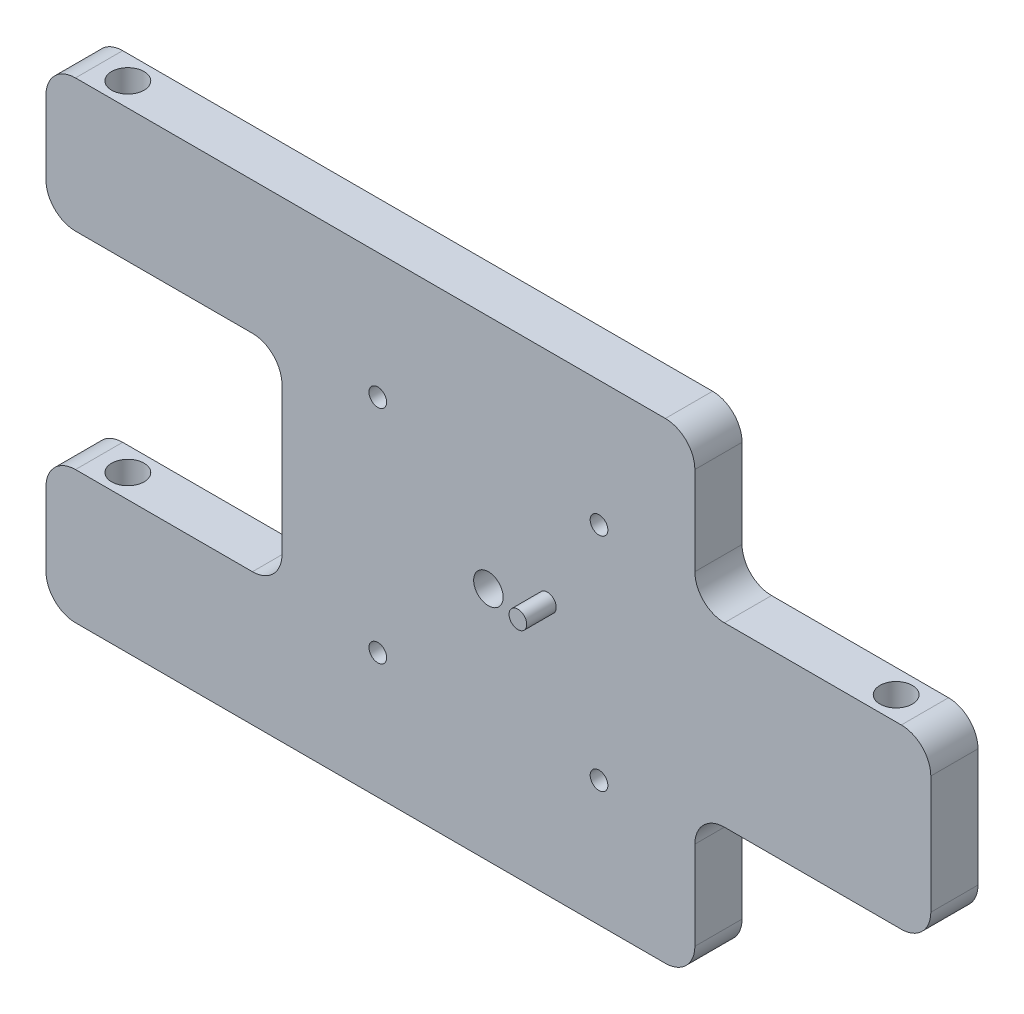
ISO-10303-21;
HEADER;
FILE_DESCRIPTION(('STEP AP214'),'2;1');
FILE_NAME('part.step','',(''),(''),'','','');
FILE_SCHEMA(('AUTOMOTIVE_DESIGN { 1 0 10303 214 1 1 1 1 }'));
ENDSEC;
DATA;
#1=APPLICATION_CONTEXT('core data for automotive mechanical design processes');
#2=APPLICATION_PROTOCOL_DEFINITION('international standard','automotive_design',2000,#1);
#3=PRODUCT_CONTEXT('',#1,'mechanical');
#4=PRODUCT('Part','Part','',(#3));
#5=PRODUCT_RELATED_PRODUCT_CATEGORY('part','',(#4));
#6=PRODUCT_DEFINITION_FORMATION('','',#4);
#7=PRODUCT_DEFINITION_CONTEXT('part definition',#1,'design');
#8=PRODUCT_DEFINITION('design','',#6,#7);
#9=PRODUCT_DEFINITION_SHAPE('','',#8);
#10=(LENGTH_UNIT() NAMED_UNIT(*) SI_UNIT(.MILLI.,.METRE.));
#11=(NAMED_UNIT(*) PLANE_ANGLE_UNIT() SI_UNIT($,.RADIAN.));
#12=(NAMED_UNIT(*) SI_UNIT($,.STERADIAN.) SOLID_ANGLE_UNIT());
#13=UNCERTAINTY_MEASURE_WITH_UNIT(LENGTH_MEASURE(1.E-05),#10,'distance_accuracy_value','');
#14=(GEOMETRIC_REPRESENTATION_CONTEXT(3) GLOBAL_UNCERTAINTY_ASSIGNED_CONTEXT((#13)) GLOBAL_UNIT_ASSIGNED_CONTEXT((#10,
#11,#12)) REPRESENTATION_CONTEXT('',''));
#15=CARTESIAN_POINT('',(0.,0.,0.));
#16=DIRECTION('',(0.,0.,1.));
#17=DIRECTION('',(1.,0.,0.));
#18=AXIS2_PLACEMENT_3D('',#15,#16,#17);
#19=CARTESIAN_POINT('',(-75.,40.,4.00000000000003));
#20=DIRECTION('',(1.,0.,0.));
#21=DIRECTION('',(0.,0.,-1.));
#22=AXIS2_PLACEMENT_3D('',#19,#20,#21);
#23=PLANE('',#22);
#24=DIRECTION('',(0.,-1.,0.));
#25=VECTOR('',#24,1.);
#26=CARTESIAN_POINT('',(-75.,40.,-3.99999999999999));
#27=LINE('',#26,#25);
#28=CARTESIAN_POINT('',(-75.,35.,-3.99999999999999));
#29=VERTEX_POINT('',#28);
#30=CARTESIAN_POINT('',(-75.,22.5,-3.99999999999999));
#31=VERTEX_POINT('',#30);
#32=EDGE_CURVE('E308',#29,#31,#27,.T.);
#33=ORIENTED_EDGE('',*,*,#32,.T.);
#34=DIRECTION('',(0.,0.,1.));
#35=VECTOR('',#34,1.);
#36=CARTESIAN_POINT('',(-75.,22.5,4.00000000000003));
#37=LINE('',#36,#35);
#38=CARTESIAN_POINT('',(-75.,22.5,4.00000000000003));
#39=VERTEX_POINT('',#38);
#40=EDGE_CURVE('E406',#31,#39,#37,.T.);
#41=ORIENTED_EDGE('',*,*,#40,.T.);
#42=DIRECTION('',(0.,-1.,0.));
#43=VECTOR('',#42,1.);
#44=CARTESIAN_POINT('',(-75.,40.,4.00000000000003));
#45=LINE('',#44,#43);
#46=CARTESIAN_POINT('',(-75.,35.,4.00000000000003));
#47=VERTEX_POINT('',#46);
#48=EDGE_CURVE('E319',#47,#39,#45,.T.);
#49=ORIENTED_EDGE('',*,*,#48,.F.);
#50=DIRECTION('',(0.,0.,1.));
#51=VECTOR('',#50,1.);
#52=CARTESIAN_POINT('',(-75.,35.,-3.99999999999999));
#53=LINE('',#52,#51);
#54=EDGE_CURVE('E57',#47,#29,#53,.F.);
#55=ORIENTED_EDGE('',*,*,#54,.T.);
#56=EDGE_LOOP('',(#33,#41,#49,#55));
#57=FACE_BOUND('',#56,.T.);
#58=ADVANCED_FACE('F35',(#57),#23,.F.);
#59=CARTESIAN_POINT('',(-65.125,40.,0.));
#60=DIRECTION('',(0.,-1.,0.));
#61=DIRECTION('',(0.,0.,-1.));
#62=AXIS2_PLACEMENT_3D('',#59,#60,#61);
#63=CYLINDRICAL_SURFACE('',#62,2.75000000000001);
#64=CARTESIAN_POINT('',(-65.125,17.5,0.));
#65=DIRECTION('',(0.,1.,0.));
#66=DIRECTION('',(-1.,0.,0.));
#67=AXIS2_PLACEMENT_3D('',#64,#65,#66);
#68=CIRCLE('',#67,2.75000000000001);
#69=CARTESIAN_POINT('',(-67.875,17.5,0.));
#70=VERTEX_POINT('',#69);
#71=EDGE_CURVE('E284',#70,#70,#68,.T.);
#72=ORIENTED_EDGE('',*,*,#71,.F.);
#73=EDGE_LOOP('',(#72));
#74=FACE_BOUND('',#73,.T.);
#75=CARTESIAN_POINT('',(-65.125,40.,0.));
#76=DIRECTION('',(0.,1.,0.));
#77=DIRECTION('',(0.,0.,1.));
#78=AXIS2_PLACEMENT_3D('',#75,#76,#77);
#79=CIRCLE('',#78,2.75000000000001);
#80=CARTESIAN_POINT('',(-65.125,40.,2.75000000000002));
#81=VERTEX_POINT('',#80);
#82=EDGE_CURVE('E291',#81,#81,#79,.T.);
#83=ORIENTED_EDGE('',*,*,#82,.T.);
#84=EDGE_LOOP('',(#83));
#85=FACE_BOUND('',#84,.T.);
#86=ADVANCED_FACE('F553',(#74,#85),#63,.F.);
#87=CARTESIAN_POINT('',(0.,40.,0.));
#88=DIRECTION('',(0.,1.,0.));
#89=DIRECTION('',(0.,0.,1.));
#90=AXIS2_PLACEMENT_3D('',#87,#88,#89);
#91=PLANE('',#90);
#92=DIRECTION('',(1.,0.,0.));
#93=VECTOR('',#92,1.);
#94=CARTESIAN_POINT('',(75.,40.,4.00000000000001));
#95=LINE('',#94,#93);
#96=CARTESIAN_POINT('',(-70.,40.,4.00000000000003));
#97=VERTEX_POINT('',#96);
#98=CARTESIAN_POINT('',(30.,40.,4.00000000000001));
#99=VERTEX_POINT('',#98);
#100=EDGE_CURVE('E297',#97,#99,#95,.T.);
#101=ORIENTED_EDGE('',*,*,#100,.T.);
#102=DIRECTION('',(0.,0.,1.));
#103=VECTOR('',#102,1.);
#104=CARTESIAN_POINT('',(30.,40.,-3.99999999999999));
#105=LINE('',#104,#103);
#106=CARTESIAN_POINT('',(30.,40.,-3.99999999999999));
#107=VERTEX_POINT('',#106);
#108=EDGE_CURVE('E203',#99,#107,#105,.F.);
#109=ORIENTED_EDGE('',*,*,#108,.T.);
#110=DIRECTION('',(-1.,0.,0.));
#111=VECTOR('',#110,1.);
#112=CARTESIAN_POINT('',(75.,40.,-3.99999999999999));
#113=LINE('',#112,#111);
#114=CARTESIAN_POINT('',(-70.,40.,-3.99999999999999));
#115=VERTEX_POINT('',#114);
#116=EDGE_CURVE('E299',#107,#115,#113,.T.);
#117=ORIENTED_EDGE('',*,*,#116,.T.);
#118=DIRECTION('',(0.,0.,1.));
#119=VECTOR('',#118,1.);
#120=CARTESIAN_POINT('',(-70.,40.,4.00000000000003));
#121=LINE('',#120,#119);
#122=EDGE_CURVE('E208',#115,#97,#121,.T.);
#123=ORIENTED_EDGE('',*,*,#122,.T.);
#124=EDGE_LOOP('',(#101,#109,#117,#123));
#125=FACE_BOUND('',#124,.T.);
#126=ORIENTED_EDGE('',*,*,#82,.F.);
#127=EDGE_LOOP('',(#126));
#128=FACE_BOUND('',#127,.T.);
#129=ADVANCED_FACE('F561',(#125,#128),#91,.T.);
#130=CARTESIAN_POINT('',(0.,-40.,0.));
#131=DIRECTION('',(0.,1.,0.));
#132=DIRECTION('',(0.,0.,1.));
#133=AXIS2_PLACEMENT_3D('',#130,#131,#132);
#134=PLANE('',#133);
#135=DIRECTION('',(1.,0.,0.));
#136=VECTOR('',#135,1.);
#137=CARTESIAN_POINT('',(75.,-40.,4.00000000000001));
#138=LINE('',#137,#136);
#139=CARTESIAN_POINT('',(-70.,-40.,4.00000000000003));
#140=VERTEX_POINT('',#139);
#141=CARTESIAN_POINT('',(30.,-40.,4.00000000000001));
#142=VERTEX_POINT('',#141);
#143=EDGE_CURVE('E294',#140,#142,#138,.T.);
#144=ORIENTED_EDGE('',*,*,#143,.F.);
#145=DIRECTION('',(0.,0.,1.));
#146=VECTOR('',#145,1.);
#147=CARTESIAN_POINT('',(-70.,-40.,0.));
#148=LINE('',#147,#146);
#149=CARTESIAN_POINT('',(-70.,-40.,-3.99999999999999));
#150=VERTEX_POINT('',#149);
#151=EDGE_CURVE('E378',#140,#150,#148,.F.);
#152=ORIENTED_EDGE('',*,*,#151,.T.);
#153=DIRECTION('',(-1.,0.,0.));
#154=VECTOR('',#153,1.);
#155=CARTESIAN_POINT('',(75.,-40.,-3.99999999999999));
#156=LINE('',#155,#154);
#157=CARTESIAN_POINT('',(30.,-40.,-3.99999999999999));
#158=VERTEX_POINT('',#157);
#159=EDGE_CURVE('E300',#158,#150,#156,.T.);
#160=ORIENTED_EDGE('',*,*,#159,.F.);
#161=DIRECTION('',(0.,0.,1.));
#162=VECTOR('',#161,1.);
#163=CARTESIAN_POINT('',(30.,-40.,0.));
#164=LINE('',#163,#162);
#165=EDGE_CURVE('E375',#158,#142,#164,.T.);
#166=ORIENTED_EDGE('',*,*,#165,.T.);
#167=EDGE_LOOP('',(#144,#152,#160,#166));
#168=FACE_BOUND('',#167,.T.);
#169=CARTESIAN_POINT('',(-65.125,-40.,0.));
#170=DIRECTION('',(0.,1.,0.));
#171=DIRECTION('',(0.,0.,1.));
#172=AXIS2_PLACEMENT_3D('',#169,#170,#171);
#173=CIRCLE('',#172,2.75000000000001);
#174=CARTESIAN_POINT('',(-65.125,-40.,2.75000000000002));
#175=VERTEX_POINT('',#174);
#176=EDGE_CURVE('E288',#175,#175,#173,.T.);
#177=ORIENTED_EDGE('',*,*,#176,.T.);
#178=EDGE_LOOP('',(#177));
#179=FACE_BOUND('',#178,.T.);
#180=ADVANCED_FACE('F463',(#168,#179),#134,.F.);
#181=CARTESIAN_POINT('',(-75.,-22.5,4.00000000000003));
#182=VERTEX_POINT('',#181);
#183=CARTESIAN_POINT('',(-75.,-35.,4.00000000000003));
#184=VERTEX_POINT('',#183);
#185=EDGE_CURVE('E316',#182,#184,#45,.T.);
#186=ORIENTED_EDGE('',*,*,#185,.F.);
#187=DIRECTION('',(0.,0.,1.));
#188=VECTOR('',#187,1.);
#189=CARTESIAN_POINT('',(-75.,-22.5,4.00000000000003));
#190=LINE('',#189,#188);
#191=CARTESIAN_POINT('',(-75.,-22.5,-3.99999999999999));
#192=VERTEX_POINT('',#191);
#193=EDGE_CURVE('E373',#182,#192,#190,.F.);
#194=ORIENTED_EDGE('',*,*,#193,.T.);
#195=CARTESIAN_POINT('',(-75.,-35.,-3.99999999999999));
#196=VERTEX_POINT('',#195);
#197=EDGE_CURVE('E303',#192,#196,#27,.T.);
#198=ORIENTED_EDGE('',*,*,#197,.T.);
#199=DIRECTION('',(0.,0.,1.));
#200=VECTOR('',#199,1.);
#201=CARTESIAN_POINT('',(-75.,-35.,4.00000000000003));
#202=LINE('',#201,#200);
#203=EDGE_CURVE('E370',#196,#184,#202,.T.);
#204=ORIENTED_EDGE('',*,*,#203,.T.);
#205=EDGE_LOOP('',(#186,#194,#198,#204));
#206=FACE_BOUND('',#205,.T.);
#207=ADVANCED_FACE('F453',(#206),#23,.F.);
#208=CARTESIAN_POINT('',(75.,40.,4.00000000000001));
#209=DIRECTION('',(0.,0.,-1.));
#210=DIRECTION('',(-1.,0.,0.));
#211=AXIS2_PLACEMENT_3D('',#208,#209,#210);
#212=PLANE('',#211);
#213=CARTESIAN_POINT('',(10.,3.,4.00000000000002));
#214=DIRECTION('',(0.,0.,-1.));
#215=DIRECTION('',(-1.,0.,0.));
#216=AXIS2_PLACEMENT_3D('',#213,#214,#215);
#217=CIRCLE('',#216,1.5);
#218=CARTESIAN_POINT('',(8.5,3.,4.00000000000002));
#219=VERTEX_POINT('',#218);
#220=EDGE_CURVE('E11',#219,#219,#217,.F.);
#221=ORIENTED_EDGE('',*,*,#220,.F.);
#222=EDGE_LOOP('',(#221));
#223=FACE_BOUND('',#222,.T.);
#224=CARTESIAN_POINT('',(0.,0.,4.00000000000002));
#225=DIRECTION('',(0.,0.,1.));
#226=DIRECTION('',(1.,0.,0.));
#227=AXIS2_PLACEMENT_3D('',#224,#225,#226);
#228=CIRCLE('',#227,2.5);
#229=CARTESIAN_POINT('',(2.5,0.,4.00000000000002));
#230=VERTEX_POINT('',#229);
#231=EDGE_CURVE('E507',#230,#230,#228,.T.);
#232=ORIENTED_EDGE('',*,*,#231,.F.);
#233=EDGE_LOOP('',(#232));
#234=FACE_BOUND('',#233,.T.);
#235=CARTESIAN_POINT('',(18.75,18.75,4.00000000000002));
#236=DIRECTION('',(0.,0.,1.));
#237=DIRECTION('',(1.,0.,0.));
#238=AXIS2_PLACEMENT_3D('',#235,#236,#237);
#239=CIRCLE('',#238,1.5);
#240=CARTESIAN_POINT('',(20.25,18.75,4.00000000000002));
#241=VERTEX_POINT('',#240);
#242=EDGE_CURVE('E269',#241,#241,#239,.T.);
#243=ORIENTED_EDGE('',*,*,#242,.F.);
#244=EDGE_LOOP('',(#243));
#245=FACE_BOUND('',#244,.T.);
#246=CARTESIAN_POINT('',(18.75,-18.75,4.00000000000002));
#247=DIRECTION('',(0.,0.,1.));
#248=DIRECTION('',(1.,0.,0.));
#249=AXIS2_PLACEMENT_3D('',#246,#247,#248);
#250=CIRCLE('',#249,1.5);
#251=CARTESIAN_POINT('',(20.25,-18.75,4.00000000000002));
#252=VERTEX_POINT('',#251);
#253=EDGE_CURVE('E275',#252,#252,#250,.T.);
#254=ORIENTED_EDGE('',*,*,#253,.F.);
#255=EDGE_LOOP('',(#254));
#256=FACE_BOUND('',#255,.T.);
#257=CARTESIAN_POINT('',(-18.75,-18.75,4.00000000000002));
#258=DIRECTION('',(0.,0.,1.));
#259=DIRECTION('',(1.,0.,0.));
#260=AXIS2_PLACEMENT_3D('',#257,#258,#259);
#261=CIRCLE('',#260,1.5);
#262=CARTESIAN_POINT('',(-17.25,-18.75,4.00000000000002));
#263=VERTEX_POINT('',#262);
#264=EDGE_CURVE('E281',#263,#263,#261,.T.);
#265=ORIENTED_EDGE('',*,*,#264,.F.);
#266=EDGE_LOOP('',(#265));
#267=FACE_BOUND('',#266,.T.);
#268=CARTESIAN_POINT('',(-18.75,18.75,4.00000000000002));
#269=DIRECTION('',(0.,0.,1.));
#270=DIRECTION('',(1.,0.,0.));
#271=AXIS2_PLACEMENT_3D('',#268,#269,#270);
#272=CIRCLE('',#271,1.5);
#273=CARTESIAN_POINT('',(-17.25,18.75,4.00000000000002));
#274=VERTEX_POINT('',#273);
#275=EDGE_CURVE('E268',#274,#274,#272,.T.);
#276=ORIENTED_EDGE('',*,*,#275,.F.);
#277=EDGE_LOOP('',(#276));
#278=FACE_BOUND('',#277,.T.);
#279=DIRECTION('',(0.,-1.,0.));
#280=VECTOR('',#279,1.);
#281=CARTESIAN_POINT('',(35.,40.,4.00000000000002));
#282=LINE('',#281,#280);
#283=CARTESIAN_POINT('',(35.,35.,4.00000000000002));
#284=VERTEX_POINT('',#283);
#285=CARTESIAN_POINT('',(35.,20.,4.00000000000002));
#286=VERTEX_POINT('',#285);
#287=EDGE_CURVE('E215',#284,#286,#282,.T.);
#288=ORIENTED_EDGE('',*,*,#287,.F.);
#289=CARTESIAN_POINT('',(30.,35.,4.00000000000001));
#290=DIRECTION('',(0.,0.,-1.));
#291=DIRECTION('',(-1.,0.,0.));
#292=AXIS2_PLACEMENT_3D('',#289,#290,#291);
#293=CIRCLE('',#292,5.);
#294=EDGE_CURVE('E198',#284,#99,#293,.F.);
#295=ORIENTED_EDGE('',*,*,#294,.T.);
#296=ORIENTED_EDGE('',*,*,#100,.F.);
#297=CARTESIAN_POINT('',(-70.,35.,4.00000000000003));
#298=DIRECTION('',(0.,0.,-1.));
#299=DIRECTION('',(-1.,0.,0.));
#300=AXIS2_PLACEMENT_3D('',#297,#298,#299);
#301=CIRCLE('',#300,5.);
#302=EDGE_CURVE('E219',#97,#47,#301,.F.);
#303=ORIENTED_EDGE('',*,*,#302,.T.);
#304=ORIENTED_EDGE('',*,*,#48,.T.);
#305=CARTESIAN_POINT('',(-70.,22.5,4.00000000000003));
#306=DIRECTION('',(0.,0.,-1.));
#307=DIRECTION('',(-1.,0.,0.));
#308=AXIS2_PLACEMENT_3D('',#305,#306,#307);
#309=CIRCLE('',#308,5.);
#310=CARTESIAN_POINT('',(-70.,17.5,4.00000000000002));
#311=VERTEX_POINT('',#310);
#312=EDGE_CURVE('E331',#39,#311,#309,.F.);
#313=ORIENTED_EDGE('',*,*,#312,.T.);
#314=DIRECTION('',(-1.,0.,0.));
#315=VECTOR('',#314,1.);
#316=CARTESIAN_POINT('',(-75.,17.5,4.00000000000002));
#317=LINE('',#316,#315);
#318=CARTESIAN_POINT('',(-40.,17.5,4.00000000000002));
#319=VERTEX_POINT('',#318);
#320=EDGE_CURVE('E250',#319,#311,#317,.T.);
#321=ORIENTED_EDGE('',*,*,#320,.F.);
#322=CARTESIAN_POINT('',(-40.,12.5,4.00000000000002));
#323=DIRECTION('',(0.,0.,-1.));
#324=DIRECTION('',(-1.,0.,0.));
#325=AXIS2_PLACEMENT_3D('',#322,#323,#324);
#326=CIRCLE('',#325,5.);
#327=CARTESIAN_POINT('',(-35.,12.5,4.00000000000002));
#328=VERTEX_POINT('',#327);
#329=EDGE_CURVE('E420',#319,#328,#326,.T.);
#330=ORIENTED_EDGE('',*,*,#329,.T.);
#331=DIRECTION('',(0.,1.,0.));
#332=VECTOR('',#331,1.);
#333=CARTESIAN_POINT('',(-35.,17.5,4.00000000000002));
#334=LINE('',#333,#332);
#335=CARTESIAN_POINT('',(-35.,-12.5,4.00000000000002));
#336=VERTEX_POINT('',#335);
#337=EDGE_CURVE('E259',#336,#328,#334,.T.);
#338=ORIENTED_EDGE('',*,*,#337,.F.);
#339=CARTESIAN_POINT('',(-40.,-12.5,4.00000000000002));
#340=DIRECTION('',(0.,0.,-1.));
#341=DIRECTION('',(-1.,0.,0.));
#342=AXIS2_PLACEMENT_3D('',#339,#340,#341);
#343=CIRCLE('',#342,5.);
#344=CARTESIAN_POINT('',(-40.,-17.5,4.00000000000002));
#345=VERTEX_POINT('',#344);
#346=EDGE_CURVE('E409',#336,#345,#343,.T.);
#347=ORIENTED_EDGE('',*,*,#346,.T.);
#348=DIRECTION('',(1.,0.,0.));
#349=VECTOR('',#348,1.);
#350=CARTESIAN_POINT('',(-35.,-17.5,4.00000000000002));
#351=LINE('',#350,#349);
#352=CARTESIAN_POINT('',(-70.,-17.5,4.00000000000002));
#353=VERTEX_POINT('',#352);
#354=EDGE_CURVE('E256',#353,#345,#351,.T.);
#355=ORIENTED_EDGE('',*,*,#354,.F.);
#356=CARTESIAN_POINT('',(-70.,-22.5,4.00000000000003));
#357=DIRECTION('',(0.,0.,-1.));
#358=DIRECTION('',(-1.,0.,0.));
#359=AXIS2_PLACEMENT_3D('',#356,#357,#358);
#360=CIRCLE('',#359,5.);
#361=EDGE_CURVE('E209',#353,#182,#360,.F.);
#362=ORIENTED_EDGE('',*,*,#361,.T.);
#363=ORIENTED_EDGE('',*,*,#185,.T.);
#364=CARTESIAN_POINT('',(-70.,-35.,4.00000000000003));
#365=DIRECTION('',(0.,0.,-1.));
#366=DIRECTION('',(-1.,0.,0.));
#367=AXIS2_PLACEMENT_3D('',#364,#365,#366);
#368=CIRCLE('',#367,5.);
#369=EDGE_CURVE('E339',#184,#140,#368,.F.);
#370=ORIENTED_EDGE('',*,*,#369,.T.);
#371=ORIENTED_EDGE('',*,*,#143,.T.);
#372=CARTESIAN_POINT('',(30.,-35.,4.00000000000001));
#373=DIRECTION('',(0.,0.,-1.));
#374=DIRECTION('',(-1.,0.,0.));
#375=AXIS2_PLACEMENT_3D('',#372,#373,#374);
#376=CIRCLE('',#375,5.);
#377=CARTESIAN_POINT('',(35.,-35.,4.00000000000002));
#378=VERTEX_POINT('',#377);
#379=EDGE_CURVE('E337',#142,#378,#376,.F.);
#380=ORIENTED_EDGE('',*,*,#379,.T.);
#381=DIRECTION('',(0.,-1.,0.));
#382=VECTOR('',#381,1.);
#383=CARTESIAN_POINT('',(35.,-40.,4.00000000000002));
#384=LINE('',#383,#382);
#385=CARTESIAN_POINT('',(35.,-20.,4.00000000000002));
#386=VERTEX_POINT('',#385);
#387=EDGE_CURVE('E238',#386,#378,#384,.T.);
#388=ORIENTED_EDGE('',*,*,#387,.F.);
#389=CARTESIAN_POINT('',(40.,-20.,4.00000000000001));
#390=DIRECTION('',(0.,0.,-1.));
#391=DIRECTION('',(-1.,0.,0.));
#392=AXIS2_PLACEMENT_3D('',#389,#390,#391);
#393=CIRCLE('',#392,5.);
#394=CARTESIAN_POINT('',(40.,-15.,4.00000000000002));
#395=VERTEX_POINT('',#394);
#396=EDGE_CURVE('E413',#386,#395,#393,.T.);
#397=ORIENTED_EDGE('',*,*,#396,.T.);
#398=DIRECTION('',(-1.,0.,0.));
#399=VECTOR('',#398,1.);
#400=CARTESIAN_POINT('',(35.,-15.,4.00000000000002));
#401=LINE('',#400,#399);
#402=CARTESIAN_POINT('',(70.,-15.,4.00000000000002));
#403=VERTEX_POINT('',#402);
#404=EDGE_CURVE('E240',#403,#395,#401,.T.);
#405=ORIENTED_EDGE('',*,*,#404,.F.);
#406=CARTESIAN_POINT('',(70.,-9.99999999999999,4.00000000000001));
#407=DIRECTION('',(0.,0.,-1.));
#408=DIRECTION('',(-1.,0.,0.));
#409=AXIS2_PLACEMENT_3D('',#406,#407,#408);
#410=CIRCLE('',#409,5.);
#411=CARTESIAN_POINT('',(75.,-9.99999999999999,4.00000000000001));
#412=VERTEX_POINT('',#411);
#413=EDGE_CURVE('E335',#403,#412,#410,.F.);
#414=ORIENTED_EDGE('',*,*,#413,.T.);
#415=DIRECTION('',(0.,-1.,0.));
#416=VECTOR('',#415,1.);
#417=CARTESIAN_POINT('',(75.,40.,4.00000000000001));
#418=LINE('',#417,#416);
#419=CARTESIAN_POINT('',(75.,9.99999999999999,4.00000000000001));
#420=VERTEX_POINT('',#419);
#421=EDGE_CURVE('E313',#420,#412,#418,.T.);
#422=ORIENTED_EDGE('',*,*,#421,.F.);
#423=CARTESIAN_POINT('',(70.,9.99999999999999,4.00000000000001));
#424=DIRECTION('',(0.,0.,-1.));
#425=DIRECTION('',(-1.,0.,0.));
#426=AXIS2_PLACEMENT_3D('',#423,#424,#425);
#427=CIRCLE('',#426,5.);
#428=CARTESIAN_POINT('',(70.,15.,4.00000000000002));
#429=VERTEX_POINT('',#428);
#430=EDGE_CURVE('E333',#420,#429,#427,.F.);
#431=ORIENTED_EDGE('',*,*,#430,.T.);
#432=DIRECTION('',(1.,0.,0.));
#433=VECTOR('',#432,1.);
#434=CARTESIAN_POINT('',(35.,15.,4.00000000000002));
#435=LINE('',#434,#433);
#436=CARTESIAN_POINT('',(40.,15.,4.00000000000002));
#437=VERTEX_POINT('',#436);
#438=EDGE_CURVE('E225',#437,#429,#435,.T.);
#439=ORIENTED_EDGE('',*,*,#438,.F.);
#440=CARTESIAN_POINT('',(40.,20.,4.00000000000001));
#441=DIRECTION('',(0.,0.,-1.));
#442=DIRECTION('',(-1.,0.,0.));
#443=AXIS2_PLACEMENT_3D('',#440,#441,#442);
#444=CIRCLE('',#443,5.);
#445=EDGE_CURVE('E224',#437,#286,#444,.T.);
#446=ORIENTED_EDGE('',*,*,#445,.T.);
#447=EDGE_LOOP('',(#288,#295,#296,#303,#304,#313,#321,#330,#338,#347,#355,#362,#363,#370,#371,
#380,#388,#397,#405,#414,#422,#431,#439,#446));
#448=FACE_BOUND('',#447,.T.);
#449=ADVANCED_FACE('F222',(#223,#234,#245,#256,#267,#278,#448),#212,.F.);
#450=CARTESIAN_POINT('',(75.,40.,4.00000000000001));
#451=DIRECTION('',(-1.,0.,0.));
#452=DIRECTION('',(0.,0.,1.));
#453=AXIS2_PLACEMENT_3D('',#450,#451,#452);
#454=PLANE('',#453);
#455=ORIENTED_EDGE('',*,*,#421,.T.);
#456=DIRECTION('',(0.,0.,1.));
#457=VECTOR('',#456,1.);
#458=CARTESIAN_POINT('',(75.,-9.99999999999999,4.00000000000001));
#459=LINE('',#458,#457);
#460=CARTESIAN_POINT('',(75.,-9.99999999999999,-3.99999999999999));
#461=VERTEX_POINT('',#460);
#462=EDGE_CURVE('E393',#412,#461,#459,.F.);
#463=ORIENTED_EDGE('',*,*,#462,.T.);
#464=DIRECTION('',(0.,-1.,0.));
#465=VECTOR('',#464,1.);
#466=CARTESIAN_POINT('',(75.,40.,-3.99999999999999));
#467=LINE('',#466,#465);
#468=CARTESIAN_POINT('',(75.,9.99999999999999,-3.99999999999999));
#469=VERTEX_POINT('',#468);
#470=EDGE_CURVE('E310',#469,#461,#467,.T.);
#471=ORIENTED_EDGE('',*,*,#470,.F.);
#472=DIRECTION('',(0.,0.,1.));
#473=VECTOR('',#472,1.);
#474=CARTESIAN_POINT('',(75.,9.99999999999999,4.00000000000001));
#475=LINE('',#474,#473);
#476=EDGE_CURVE('E390',#469,#420,#475,.T.);
#477=ORIENTED_EDGE('',*,*,#476,.T.);
#478=EDGE_LOOP('',(#455,#463,#471,#477));
#479=FACE_BOUND('',#478,.T.);
#480=ADVANCED_FACE('F491',(#479),#454,.F.);
#481=CARTESIAN_POINT('',(75.,40.,-3.99999999999999));
#482=DIRECTION('',(0.,0.,1.));
#483=DIRECTION('',(1.,0.,0.));
#484=AXIS2_PLACEMENT_3D('',#481,#482,#483);
#485=PLANE('',#484);
#486=CARTESIAN_POINT('',(0.,0.,-3.99999999999999));
#487=DIRECTION('',(0.,0.,1.));
#488=DIRECTION('',(1.,0.,0.));
#489=AXIS2_PLACEMENT_3D('',#486,#487,#488);
#490=CIRCLE('',#489,2.5);
#491=CARTESIAN_POINT('',(2.5,0.,-3.99999999999999));
#492=VERTEX_POINT('',#491);
#493=EDGE_CURVE('E243',#492,#492,#490,.T.);
#494=ORIENTED_EDGE('',*,*,#493,.T.);
#495=EDGE_LOOP('',(#494));
#496=FACE_BOUND('',#495,.T.);
#497=CARTESIAN_POINT('',(18.75,18.75,-3.99999999999999));
#498=DIRECTION('',(0.,0.,1.));
#499=DIRECTION('',(1.,0.,0.));
#500=AXIS2_PLACEMENT_3D('',#497,#498,#499);
#501=CIRCLE('',#500,1.5);
#502=CARTESIAN_POINT('',(20.25,18.75,-3.99999999999999));
#503=VERTEX_POINT('',#502);
#504=EDGE_CURVE('E265',#503,#503,#501,.T.);
#505=ORIENTED_EDGE('',*,*,#504,.T.);
#506=EDGE_LOOP('',(#505));
#507=FACE_BOUND('',#506,.T.);
#508=CARTESIAN_POINT('',(18.75,-18.75,-3.99999999999999));
#509=DIRECTION('',(0.,0.,1.));
#510=DIRECTION('',(1.,0.,0.));
#511=AXIS2_PLACEMENT_3D('',#508,#509,#510);
#512=CIRCLE('',#511,1.5);
#513=CARTESIAN_POINT('',(20.25,-18.75,-3.99999999999999));
#514=VERTEX_POINT('',#513);
#515=EDGE_CURVE('E272',#514,#514,#512,.T.);
#516=ORIENTED_EDGE('',*,*,#515,.T.);
#517=EDGE_LOOP('',(#516));
#518=FACE_BOUND('',#517,.T.);
#519=CARTESIAN_POINT('',(-18.75,-18.75,-3.99999999999999));
#520=DIRECTION('',(0.,0.,1.));
#521=DIRECTION('',(1.,0.,0.));
#522=AXIS2_PLACEMENT_3D('',#519,#520,#521);
#523=CIRCLE('',#522,1.5);
#524=CARTESIAN_POINT('',(-17.25,-18.75,-3.99999999999999));
#525=VERTEX_POINT('',#524);
#526=EDGE_CURVE('E278',#525,#525,#523,.T.);
#527=ORIENTED_EDGE('',*,*,#526,.T.);
#528=EDGE_LOOP('',(#527));
#529=FACE_BOUND('',#528,.T.);
#530=CARTESIAN_POINT('',(-18.75,18.75,-3.99999999999999));
#531=DIRECTION('',(0.,0.,1.));
#532=DIRECTION('',(1.,0.,0.));
#533=AXIS2_PLACEMENT_3D('',#530,#531,#532);
#534=CIRCLE('',#533,1.5);
#535=CARTESIAN_POINT('',(-17.25,18.75,-3.99999999999999));
#536=VERTEX_POINT('',#535);
#537=EDGE_CURVE('E285',#536,#536,#534,.T.);
#538=ORIENTED_EDGE('',*,*,#537,.T.);
#539=EDGE_LOOP('',(#538));
#540=FACE_BOUND('',#539,.T.);
#541=ORIENTED_EDGE('',*,*,#116,.F.);
#542=CARTESIAN_POINT('',(30.,35.,-3.99999999999999));
#543=DIRECTION('',(0.,0.,1.));
#544=DIRECTION('',(1.,0.,0.));
#545=AXIS2_PLACEMENT_3D('',#542,#543,#544);
#546=CIRCLE('',#545,5.);
#547=CARTESIAN_POINT('',(35.,35.,-3.99999999999999));
#548=VERTEX_POINT('',#547);
#549=EDGE_CURVE('E358',#107,#548,#546,.F.);
#550=ORIENTED_EDGE('',*,*,#549,.T.);
#551=DIRECTION('',(0.,-1.,0.));
#552=VECTOR('',#551,1.);
#553=CARTESIAN_POINT('',(35.,40.,-3.99999999999999));
#554=LINE('',#553,#552);
#555=CARTESIAN_POINT('',(35.,20.,-3.99999999999999));
#556=VERTEX_POINT('',#555);
#557=EDGE_CURVE('E218',#548,#556,#554,.T.);
#558=ORIENTED_EDGE('',*,*,#557,.T.);
#559=CARTESIAN_POINT('',(40.,20.,-3.99999999999999));
#560=DIRECTION('',(0.,0.,1.));
#561=DIRECTION('',(1.,0.,0.));
#562=AXIS2_PLACEMENT_3D('',#559,#560,#561);
#563=CIRCLE('',#562,5.);
#564=CARTESIAN_POINT('',(40.,15.,-3.99999999999999));
#565=VERTEX_POINT('',#564);
#566=EDGE_CURVE('E418',#556,#565,#563,.T.);
#567=ORIENTED_EDGE('',*,*,#566,.T.);
#568=DIRECTION('',(1.,0.,0.));
#569=VECTOR('',#568,1.);
#570=CARTESIAN_POINT('',(35.,15.,-3.99999999999999));
#571=LINE('',#570,#569);
#572=CARTESIAN_POINT('',(70.,15.,-3.99999999999999));
#573=VERTEX_POINT('',#572);
#574=EDGE_CURVE('E234',#565,#573,#571,.T.);
#575=ORIENTED_EDGE('',*,*,#574,.T.);
#576=CARTESIAN_POINT('',(70.,9.99999999999999,-3.99999999999999));
#577=DIRECTION('',(0.,0.,1.));
#578=DIRECTION('',(1.,0.,0.));
#579=AXIS2_PLACEMENT_3D('',#576,#577,#578);
#580=CIRCLE('',#579,5.);
#581=EDGE_CURVE('E348',#573,#469,#580,.F.);
#582=ORIENTED_EDGE('',*,*,#581,.T.);
#583=ORIENTED_EDGE('',*,*,#470,.T.);
#584=CARTESIAN_POINT('',(70.,-9.99999999999999,-3.99999999999999));
#585=DIRECTION('',(0.,0.,1.));
#586=DIRECTION('',(1.,0.,0.));
#587=AXIS2_PLACEMENT_3D('',#584,#585,#586);
#588=CIRCLE('',#587,5.);
#589=CARTESIAN_POINT('',(70.,-15.,-3.99999999999999));
#590=VERTEX_POINT('',#589);
#591=EDGE_CURVE('E350',#461,#590,#588,.F.);
#592=ORIENTED_EDGE('',*,*,#591,.T.);
#593=DIRECTION('',(-1.,0.,0.));
#594=VECTOR('',#593,1.);
#595=CARTESIAN_POINT('',(35.,-15.,-3.99999999999999));
#596=LINE('',#595,#594);
#597=CARTESIAN_POINT('',(40.,-15.,-3.99999999999999));
#598=VERTEX_POINT('',#597);
#599=EDGE_CURVE('E231',#590,#598,#596,.T.);
#600=ORIENTED_EDGE('',*,*,#599,.T.);
#601=CARTESIAN_POINT('',(40.,-20.,-3.99999999999999));
#602=DIRECTION('',(0.,0.,1.));
#603=DIRECTION('',(1.,0.,0.));
#604=AXIS2_PLACEMENT_3D('',#601,#602,#603);
#605=CIRCLE('',#604,5.);
#606=CARTESIAN_POINT('',(35.,-20.,-3.99999999999999));
#607=VERTEX_POINT('',#606);
#608=EDGE_CURVE('E415',#598,#607,#605,.T.);
#609=ORIENTED_EDGE('',*,*,#608,.T.);
#610=DIRECTION('',(0.,-1.,0.));
#611=VECTOR('',#610,1.);
#612=CARTESIAN_POINT('',(35.,-40.,-3.99999999999999));
#613=LINE('',#612,#611);
#614=CARTESIAN_POINT('',(35.,-35.,-3.99999999999999));
#615=VERTEX_POINT('',#614);
#616=EDGE_CURVE('E226',#607,#615,#613,.T.);
#617=ORIENTED_EDGE('',*,*,#616,.T.);
#618=CARTESIAN_POINT('',(30.,-35.,-3.99999999999999));
#619=DIRECTION('',(0.,0.,1.));
#620=DIRECTION('',(1.,0.,0.));
#621=AXIS2_PLACEMENT_3D('',#618,#619,#620);
#622=CIRCLE('',#621,5.);
#623=EDGE_CURVE('E352',#615,#158,#622,.F.);
#624=ORIENTED_EDGE('',*,*,#623,.T.);
#625=ORIENTED_EDGE('',*,*,#159,.T.);
#626=CARTESIAN_POINT('',(-70.,-35.,-3.99999999999999));
#627=DIRECTION('',(0.,0.,1.));
#628=DIRECTION('',(1.,0.,0.));
#629=AXIS2_PLACEMENT_3D('',#626,#627,#628);
#630=CIRCLE('',#629,5.);
#631=EDGE_CURVE('E354',#150,#196,#630,.F.);
#632=ORIENTED_EDGE('',*,*,#631,.T.);
#633=ORIENTED_EDGE('',*,*,#197,.F.);
#634=CARTESIAN_POINT('',(-70.,-22.5,-3.99999999999999));
#635=DIRECTION('',(0.,0.,1.));
#636=DIRECTION('',(1.,0.,0.));
#637=AXIS2_PLACEMENT_3D('',#634,#635,#636);
#638=CIRCLE('',#637,5.);
#639=CARTESIAN_POINT('',(-70.,-17.5,-3.99999999999999));
#640=VERTEX_POINT('',#639);
#641=EDGE_CURVE('E356',#192,#640,#638,.F.);
#642=ORIENTED_EDGE('',*,*,#641,.T.);
#643=DIRECTION('',(1.,0.,0.));
#644=VECTOR('',#643,1.);
#645=CARTESIAN_POINT('',(-35.,-17.5,-3.99999999999999));
#646=LINE('',#645,#644);
#647=CARTESIAN_POINT('',(-40.,-17.5,-3.99999999999999));
#648=VERTEX_POINT('',#647);
#649=EDGE_CURVE('E246',#640,#648,#646,.T.);
#650=ORIENTED_EDGE('',*,*,#649,.T.);
#651=CARTESIAN_POINT('',(-40.,-12.5,-3.99999999999999));
#652=DIRECTION('',(0.,0.,1.));
#653=DIRECTION('',(1.,0.,0.));
#654=AXIS2_PLACEMENT_3D('',#651,#652,#653);
#655=CIRCLE('',#654,5.);
#656=CARTESIAN_POINT('',(-35.,-12.5,-3.99999999999999));
#657=VERTEX_POINT('',#656);
#658=EDGE_CURVE('E411',#648,#657,#655,.T.);
#659=ORIENTED_EDGE('',*,*,#658,.T.);
#660=DIRECTION('',(0.,1.,0.));
#661=VECTOR('',#660,1.);
#662=CARTESIAN_POINT('',(-35.,17.5,-3.99999999999999));
#663=LINE('',#662,#661);
#664=CARTESIAN_POINT('',(-35.,12.5,-3.99999999999999));
#665=VERTEX_POINT('',#664);
#666=EDGE_CURVE('E249',#657,#665,#663,.T.);
#667=ORIENTED_EDGE('',*,*,#666,.T.);
#668=CARTESIAN_POINT('',(-40.,12.5,-3.99999999999999));
#669=DIRECTION('',(0.,0.,1.));
#670=DIRECTION('',(1.,0.,0.));
#671=AXIS2_PLACEMENT_3D('',#668,#669,#670);
#672=CIRCLE('',#671,5.);
#673=CARTESIAN_POINT('',(-40.,17.5,-3.99999999999999));
#674=VERTEX_POINT('',#673);
#675=EDGE_CURVE('E43',#665,#674,#672,.T.);
#676=ORIENTED_EDGE('',*,*,#675,.T.);
#677=DIRECTION('',(-1.,0.,0.));
#678=VECTOR('',#677,1.);
#679=CARTESIAN_POINT('',(-75.,17.5,-3.99999999999999));
#680=LINE('',#679,#678);
#681=CARTESIAN_POINT('',(-70.,17.5,-3.99999999999999));
#682=VERTEX_POINT('',#681);
#683=EDGE_CURVE('E253',#674,#682,#680,.T.);
#684=ORIENTED_EDGE('',*,*,#683,.T.);
#685=CARTESIAN_POINT('',(-70.,22.5,-3.99999999999999));
#686=DIRECTION('',(0.,0.,1.));
#687=DIRECTION('',(1.,0.,0.));
#688=AXIS2_PLACEMENT_3D('',#685,#686,#687);
#689=CIRCLE('',#688,5.);
#690=EDGE_CURVE('E50',#682,#31,#689,.F.);
#691=ORIENTED_EDGE('',*,*,#690,.T.);
#692=ORIENTED_EDGE('',*,*,#32,.F.);
#693=CARTESIAN_POINT('',(-70.,35.,-3.99999999999999));
#694=DIRECTION('',(0.,0.,1.));
#695=DIRECTION('',(1.,0.,0.));
#696=AXIS2_PLACEMENT_3D('',#693,#694,#695);
#697=CIRCLE('',#696,5.);
#698=EDGE_CURVE('E345',#29,#115,#697,.F.);
#699=ORIENTED_EDGE('',*,*,#698,.T.);
#700=EDGE_LOOP('',(#541,#550,#558,#567,#575,#582,#583,#592,#600,#609,#617,#624,#625,#632,#633,
#642,#650,#659,#667,#676,#684,#691,#692,#699));
#701=FACE_BOUND('',#700,.T.);
#702=ADVANCED_FACE('F424',(#496,#507,#518,#529,#540,#701),#485,.F.);
#703=CARTESIAN_POINT('',(-65.125,-17.5,0.));
#704=DIRECTION('',(0.,-1.,0.));
#705=DIRECTION('',(1.,0.,0.));
#706=AXIS2_PLACEMENT_3D('',#703,#704,#705);
#707=CIRCLE('',#706,2.75000000000001);
#708=CARTESIAN_POINT('',(-62.375,-17.5,0.));
#709=VERTEX_POINT('',#708);
#710=EDGE_CURVE('E255',#709,#709,#707,.T.);
#711=ORIENTED_EDGE('',*,*,#710,.F.);
#712=EDGE_LOOP('',(#711));
#713=FACE_BOUND('',#712,.T.);
#714=ORIENTED_EDGE('',*,*,#176,.F.);
#715=EDGE_LOOP('',(#714));
#716=FACE_BOUND('',#715,.T.);
#717=ADVANCED_FACE('F541',(#713,#716),#63,.F.);
#718=CARTESIAN_POINT('',(-18.75,18.75,-3.99999999999999));
#719=DIRECTION('',(0.,0.,1.));
#720=DIRECTION('',(1.,0.,0.));
#721=AXIS2_PLACEMENT_3D('',#718,#719,#720);
#722=CYLINDRICAL_SURFACE('',#721,1.5);
#723=ORIENTED_EDGE('',*,*,#537,.F.);
#724=EDGE_LOOP('',(#723));
#725=FACE_BOUND('',#724,.T.);
#726=ORIENTED_EDGE('',*,*,#275,.T.);
#727=EDGE_LOOP('',(#726));
#728=FACE_BOUND('',#727,.T.);
#729=ADVANCED_FACE('F538',(#725,#728),#722,.F.);
#730=CARTESIAN_POINT('',(-18.75,-18.75,-3.99999999999999));
#731=DIRECTION('',(0.,0.,1.));
#732=DIRECTION('',(1.,0.,0.));
#733=AXIS2_PLACEMENT_3D('',#730,#731,#732);
#734=CYLINDRICAL_SURFACE('',#733,1.5);
#735=ORIENTED_EDGE('',*,*,#526,.F.);
#736=EDGE_LOOP('',(#735));
#737=FACE_BOUND('',#736,.T.);
#738=ORIENTED_EDGE('',*,*,#264,.T.);
#739=EDGE_LOOP('',(#738));
#740=FACE_BOUND('',#739,.T.);
#741=ADVANCED_FACE('F540',(#737,#740),#734,.F.);
#742=CARTESIAN_POINT('',(18.75,-18.75,-3.99999999999999));
#743=DIRECTION('',(0.,0.,1.));
#744=DIRECTION('',(1.,0.,0.));
#745=AXIS2_PLACEMENT_3D('',#742,#743,#744);
#746=CYLINDRICAL_SURFACE('',#745,1.5);
#747=ORIENTED_EDGE('',*,*,#515,.F.);
#748=EDGE_LOOP('',(#747));
#749=FACE_BOUND('',#748,.T.);
#750=ORIENTED_EDGE('',*,*,#253,.T.);
#751=EDGE_LOOP('',(#750));
#752=FACE_BOUND('',#751,.T.);
#753=ADVANCED_FACE('F548',(#749,#752),#746,.F.);
#754=CARTESIAN_POINT('',(18.75,18.75,-3.99999999999999));
#755=DIRECTION('',(0.,0.,1.));
#756=DIRECTION('',(1.,0.,0.));
#757=AXIS2_PLACEMENT_3D('',#754,#755,#756);
#758=CYLINDRICAL_SURFACE('',#757,1.5);
#759=ORIENTED_EDGE('',*,*,#504,.F.);
#760=EDGE_LOOP('',(#759));
#761=FACE_BOUND('',#760,.T.);
#762=ORIENTED_EDGE('',*,*,#242,.T.);
#763=EDGE_LOOP('',(#762));
#764=FACE_BOUND('',#763,.T.);
#765=ADVANCED_FACE('F672',(#761,#764),#758,.F.);
#766=CARTESIAN_POINT('',(-75.,17.5,-3.99999999999999));
#767=DIRECTION('',(0.,1.,0.));
#768=DIRECTION('',(-1.,0.,0.));
#769=AXIS2_PLACEMENT_3D('',#766,#767,#768);
#770=PLANE('',#769);
#771=ORIENTED_EDGE('',*,*,#71,.T.);
#772=EDGE_LOOP('',(#771));
#773=FACE_BOUND('',#772,.T.);
#774=ORIENTED_EDGE('',*,*,#683,.F.);
#775=DIRECTION('',(0.,0.,1.));
#776=VECTOR('',#775,1.);
#777=CARTESIAN_POINT('',(-40.,17.5,4.00000000000002));
#778=LINE('',#777,#776);
#779=EDGE_CURVE('E402',#674,#319,#778,.T.);
#780=ORIENTED_EDGE('',*,*,#779,.T.);
#781=ORIENTED_EDGE('',*,*,#320,.T.);
#782=DIRECTION('',(0.,0.,1.));
#783=VECTOR('',#782,1.);
#784=CARTESIAN_POINT('',(-70.,17.5,-3.99999999999999));
#785=LINE('',#784,#783);
#786=EDGE_CURVE('E400',#311,#682,#785,.F.);
#787=ORIENTED_EDGE('',*,*,#786,.T.);
#788=EDGE_LOOP('',(#774,#780,#781,#787));
#789=FACE_BOUND('',#788,.T.);
#790=ADVANCED_FACE('F430',(#773,#789),#770,.F.);
#791=CARTESIAN_POINT('',(-35.,17.5,-3.99999999999999));
#792=DIRECTION('',(1.,0.,0.));
#793=DIRECTION('',(0.,0.,-1.));
#794=AXIS2_PLACEMENT_3D('',#791,#792,#793);
#795=PLANE('',#794);
#796=ORIENTED_EDGE('',*,*,#666,.F.);
#797=DIRECTION('',(0.,0.,1.));
#798=VECTOR('',#797,1.);
#799=CARTESIAN_POINT('',(-35.,-12.5,4.00000000000002));
#800=LINE('',#799,#798);
#801=EDGE_CURVE('E362',#657,#336,#800,.T.);
#802=ORIENTED_EDGE('',*,*,#801,.T.);
#803=ORIENTED_EDGE('',*,*,#337,.T.);
#804=DIRECTION('',(0.,0.,1.));
#805=VECTOR('',#804,1.);
#806=CARTESIAN_POINT('',(-35.,12.5,-3.99999999999999));
#807=LINE('',#806,#805);
#808=EDGE_CURVE('E360',#328,#665,#807,.F.);
#809=ORIENTED_EDGE('',*,*,#808,.T.);
#810=EDGE_LOOP('',(#796,#802,#803,#809));
#811=FACE_BOUND('',#810,.T.);
#812=ADVANCED_FACE('F436',(#811),#795,.F.);
#813=CARTESIAN_POINT('',(-35.,-17.5,-3.99999999999999));
#814=DIRECTION('',(0.,-1.,0.));
#815=DIRECTION('',(1.,0.,0.));
#816=AXIS2_PLACEMENT_3D('',#813,#814,#815);
#817=PLANE('',#816);
#818=ORIENTED_EDGE('',*,*,#710,.T.);
#819=EDGE_LOOP('',(#818));
#820=FACE_BOUND('',#819,.T.);
#821=ORIENTED_EDGE('',*,*,#354,.T.);
#822=DIRECTION('',(0.,0.,1.));
#823=VECTOR('',#822,1.);
#824=CARTESIAN_POINT('',(-40.,-17.5,-3.99999999999999));
#825=LINE('',#824,#823);
#826=EDGE_CURVE('E368',#345,#648,#825,.F.);
#827=ORIENTED_EDGE('',*,*,#826,.T.);
#828=ORIENTED_EDGE('',*,*,#649,.F.);
#829=DIRECTION('',(0.,0.,1.));
#830=VECTOR('',#829,1.);
#831=CARTESIAN_POINT('',(-70.,-17.5,-3.99999999999999));
#832=LINE('',#831,#830);
#833=EDGE_CURVE('E365',#640,#353,#832,.T.);
#834=ORIENTED_EDGE('',*,*,#833,.T.);
#835=EDGE_LOOP('',(#821,#827,#828,#834));
#836=FACE_BOUND('',#835,.T.);
#837=ADVANCED_FACE('F444',(#820,#836),#817,.F.);
#838=CARTESIAN_POINT('',(35.,-15.,-3.99999999999999));
#839=DIRECTION('',(0.,1.,0.));
#840=DIRECTION('',(0.,0.,1.));
#841=AXIS2_PLACEMENT_3D('',#838,#839,#840);
#842=PLANE('',#841);
#843=CARTESIAN_POINT('',(65.125,-15.,0.));
#844=DIRECTION('',(0.,1.,0.));
#845=DIRECTION('',(0.,0.,1.));
#846=AXIS2_PLACEMENT_3D('',#843,#844,#845);
#847=CIRCLE('',#846,2.75000000000001);
#848=CARTESIAN_POINT('',(65.125,-15.,2.74999999999998));
#849=VERTEX_POINT('',#848);
#850=EDGE_CURVE('E324',#849,#849,#847,.T.);
#851=ORIENTED_EDGE('',*,*,#850,.T.);
#852=EDGE_LOOP('',(#851));
#853=FACE_BOUND('',#852,.T.);
#854=ORIENTED_EDGE('',*,*,#404,.T.);
#855=DIRECTION('',(0.,0.,1.));
#856=VECTOR('',#855,1.);
#857=CARTESIAN_POINT('',(40.,-15.,-3.99999999999999));
#858=LINE('',#857,#856);
#859=EDGE_CURVE('E388',#395,#598,#858,.F.);
#860=ORIENTED_EDGE('',*,*,#859,.T.);
#861=ORIENTED_EDGE('',*,*,#599,.F.);
#862=DIRECTION('',(0.,0.,1.));
#863=VECTOR('',#862,1.);
#864=CARTESIAN_POINT('',(70.,-15.,-3.99999999999999));
#865=LINE('',#864,#863);
#866=EDGE_CURVE('E385',#590,#403,#865,.T.);
#867=ORIENTED_EDGE('',*,*,#866,.T.);
#868=EDGE_LOOP('',(#854,#860,#861,#867));
#869=FACE_BOUND('',#868,.T.);
#870=ADVANCED_FACE('F482',(#853,#869),#842,.F.);
#871=CARTESIAN_POINT('',(35.,-40.,-3.99999999999999));
#872=DIRECTION('',(-1.,0.,0.));
#873=DIRECTION('',(0.,-1.,0.));
#874=AXIS2_PLACEMENT_3D('',#871,#872,#873);
#875=PLANE('',#874);
#876=ORIENTED_EDGE('',*,*,#387,.T.);
#877=DIRECTION('',(0.,0.,1.));
#878=VECTOR('',#877,1.);
#879=CARTESIAN_POINT('',(35.,-35.,-3.99999999999999));
#880=LINE('',#879,#878);
#881=EDGE_CURVE('E383',#378,#615,#880,.F.);
#882=ORIENTED_EDGE('',*,*,#881,.T.);
#883=ORIENTED_EDGE('',*,*,#616,.F.);
#884=DIRECTION('',(0.,0.,1.));
#885=VECTOR('',#884,1.);
#886=CARTESIAN_POINT('',(35.,-20.,4.00000000000002));
#887=LINE('',#886,#885);
#888=EDGE_CURVE('E380',#607,#386,#887,.T.);
#889=ORIENTED_EDGE('',*,*,#888,.T.);
#890=EDGE_LOOP('',(#876,#882,#883,#889));
#891=FACE_BOUND('',#890,.T.);
#892=ADVANCED_FACE('F473',(#891),#875,.F.);
#893=CARTESIAN_POINT('',(35.,15.,-3.99999999999999));
#894=DIRECTION('',(0.,-1.,0.));
#895=DIRECTION('',(0.,0.,-1.));
#896=AXIS2_PLACEMENT_3D('',#893,#894,#895);
#897=PLANE('',#896);
#898=CARTESIAN_POINT('',(65.125,15.,0.));
#899=DIRECTION('',(0.,-1.,0.));
#900=DIRECTION('',(0.,0.,-1.));
#901=AXIS2_PLACEMENT_3D('',#898,#899,#900);
#902=CIRCLE('',#901,2.75000000000001);
#903=CARTESIAN_POINT('',(65.125,15.,-2.75000000000003));
#904=VERTEX_POINT('',#903);
#905=EDGE_CURVE('E260',#904,#904,#902,.T.);
#906=ORIENTED_EDGE('',*,*,#905,.T.);
#907=EDGE_LOOP('',(#906));
#908=FACE_BOUND('',#907,.T.);
#909=ORIENTED_EDGE('',*,*,#438,.T.);
#910=DIRECTION('',(0.,0.,1.));
#911=VECTOR('',#910,1.);
#912=CARTESIAN_POINT('',(70.,15.,-3.99999999999999));
#913=LINE('',#912,#911);
#914=EDGE_CURVE('E398',#429,#573,#913,.F.);
#915=ORIENTED_EDGE('',*,*,#914,.T.);
#916=ORIENTED_EDGE('',*,*,#574,.F.);
#917=DIRECTION('',(0.,0.,1.));
#918=VECTOR('',#917,1.);
#919=CARTESIAN_POINT('',(40.,15.,4.00000000000002));
#920=LINE('',#919,#918);
#921=EDGE_CURVE('E395',#565,#437,#920,.T.);
#922=ORIENTED_EDGE('',*,*,#921,.T.);
#923=EDGE_LOOP('',(#909,#915,#916,#922));
#924=FACE_BOUND('',#923,.T.);
#925=ADVANCED_FACE('F499',(#908,#924),#897,.F.);
#926=CARTESIAN_POINT('',(35.,40.,-3.99999999999999));
#927=DIRECTION('',(-1.,0.,0.));
#928=DIRECTION('',(0.,-1.,0.));
#929=AXIS2_PLACEMENT_3D('',#926,#927,#928);
#930=PLANE('',#929);
#931=ORIENTED_EDGE('',*,*,#557,.F.);
#932=DIRECTION('',(0.,0.,1.));
#933=VECTOR('',#932,1.);
#934=CARTESIAN_POINT('',(35.,35.,4.00000000000002));
#935=LINE('',#934,#933);
#936=EDGE_CURVE('E202',#548,#284,#935,.T.);
#937=ORIENTED_EDGE('',*,*,#936,.T.);
#938=ORIENTED_EDGE('',*,*,#287,.T.);
#939=DIRECTION('',(0.,0.,1.));
#940=VECTOR('',#939,1.);
#941=CARTESIAN_POINT('',(35.,20.,-3.99999999999999));
#942=LINE('',#941,#940);
#943=EDGE_CURVE('E220',#286,#556,#942,.F.);
#944=ORIENTED_EDGE('',*,*,#943,.T.);
#945=EDGE_LOOP('',(#931,#937,#938,#944));
#946=FACE_BOUND('',#945,.T.);
#947=ADVANCED_FACE('F214',(#946),#930,.F.);
#948=CARTESIAN_POINT('',(65.125,40.,0.));
#949=DIRECTION('',(0.,-1.,0.));
#950=DIRECTION('',(0.,0.,-1.));
#951=AXIS2_PLACEMENT_3D('',#948,#949,#950);
#952=CYLINDRICAL_SURFACE('',#951,2.75000000000001);
#953=ORIENTED_EDGE('',*,*,#905,.F.);
#954=EDGE_LOOP('',(#953));
#955=FACE_BOUND('',#954,.T.);
#956=ORIENTED_EDGE('',*,*,#850,.F.);
#957=EDGE_LOOP('',(#956));
#958=FACE_BOUND('',#957,.T.);
#959=ADVANCED_FACE('F604',(#955,#958),#952,.F.);
#960=CARTESIAN_POINT('',(30.,35.,-3.99999999999999));
#961=DIRECTION('',(0.,0.,-1.));
#962=DIRECTION('',(-1.,0.,0.));
#963=AXIS2_PLACEMENT_3D('',#960,#961,#962);
#964=CYLINDRICAL_SURFACE('',#963,5.);
#965=ORIENTED_EDGE('',*,*,#549,.F.);
#966=ORIENTED_EDGE('',*,*,#108,.F.);
#967=ORIENTED_EDGE('',*,*,#294,.F.);
#968=ORIENTED_EDGE('',*,*,#936,.F.);
#969=EDGE_LOOP('',(#965,#966,#967,#968));
#970=FACE_BOUND('',#969,.T.);
#971=ADVANCED_FACE('F201',(#970),#964,.T.);
#972=CARTESIAN_POINT('',(-40.,-12.5,-3.99999999999999));
#973=DIRECTION('',(0.,0.,-1.));
#974=DIRECTION('',(-1.,0.,0.));
#975=AXIS2_PLACEMENT_3D('',#972,#973,#974);
#976=CYLINDRICAL_SURFACE('',#975,5.);
#977=ORIENTED_EDGE('',*,*,#658,.F.);
#978=ORIENTED_EDGE('',*,*,#826,.F.);
#979=ORIENTED_EDGE('',*,*,#346,.F.);
#980=ORIENTED_EDGE('',*,*,#801,.F.);
#981=EDGE_LOOP('',(#977,#978,#979,#980));
#982=FACE_BOUND('',#981,.T.);
#983=ADVANCED_FACE('F440',(#982),#976,.F.);
#984=CARTESIAN_POINT('',(-70.,-22.5,-3.99999999999999));
#985=DIRECTION('',(0.,0.,1.));
#986=DIRECTION('',(1.,0.,0.));
#987=AXIS2_PLACEMENT_3D('',#984,#985,#986);
#988=CYLINDRICAL_SURFACE('',#987,5.);
#989=ORIENTED_EDGE('',*,*,#641,.F.);
#990=ORIENTED_EDGE('',*,*,#193,.F.);
#991=ORIENTED_EDGE('',*,*,#361,.F.);
#992=ORIENTED_EDGE('',*,*,#833,.F.);
#993=EDGE_LOOP('',(#989,#990,#991,#992));
#994=FACE_BOUND('',#993,.T.);
#995=ADVANCED_FACE('F449',(#994),#988,.T.);
#996=CARTESIAN_POINT('',(-70.,-35.,4.00000000000003));
#997=DIRECTION('',(0.,0.,1.));
#998=DIRECTION('',(1.,0.,0.));
#999=AXIS2_PLACEMENT_3D('',#996,#997,#998);
#1000=CYLINDRICAL_SURFACE('',#999,5.);
#1001=ORIENTED_EDGE('',*,*,#631,.F.);
#1002=ORIENTED_EDGE('',*,*,#151,.F.);
#1003=ORIENTED_EDGE('',*,*,#369,.F.);
#1004=ORIENTED_EDGE('',*,*,#203,.F.);
#1005=EDGE_LOOP('',(#1001,#1002,#1003,#1004));
#1006=FACE_BOUND('',#1005,.T.);
#1007=ADVANCED_FACE('F459',(#1006),#1000,.T.);
#1008=CARTESIAN_POINT('',(30.,-35.,0.));
#1009=DIRECTION('',(0.,0.,1.));
#1010=DIRECTION('',(1.,0.,0.));
#1011=AXIS2_PLACEMENT_3D('',#1008,#1009,#1010);
#1012=CYLINDRICAL_SURFACE('',#1011,5.);
#1013=ORIENTED_EDGE('',*,*,#623,.F.);
#1014=ORIENTED_EDGE('',*,*,#881,.F.);
#1015=ORIENTED_EDGE('',*,*,#379,.F.);
#1016=ORIENTED_EDGE('',*,*,#165,.F.);
#1017=EDGE_LOOP('',(#1013,#1014,#1015,#1016));
#1018=FACE_BOUND('',#1017,.T.);
#1019=ADVANCED_FACE('F469',(#1018),#1012,.T.);
#1020=CARTESIAN_POINT('',(40.,-20.,-3.99999999999999));
#1021=DIRECTION('',(0.,0.,-1.));
#1022=DIRECTION('',(-1.,0.,0.));
#1023=AXIS2_PLACEMENT_3D('',#1020,#1021,#1022);
#1024=CYLINDRICAL_SURFACE('',#1023,5.);
#1025=ORIENTED_EDGE('',*,*,#608,.F.);
#1026=ORIENTED_EDGE('',*,*,#859,.F.);
#1027=ORIENTED_EDGE('',*,*,#396,.F.);
#1028=ORIENTED_EDGE('',*,*,#888,.F.);
#1029=EDGE_LOOP('',(#1025,#1026,#1027,#1028));
#1030=FACE_BOUND('',#1029,.T.);
#1031=ADVANCED_FACE('F478',(#1030),#1024,.F.);
#1032=CARTESIAN_POINT('',(70.,-9.99999999999999,-3.99999999999999));
#1033=DIRECTION('',(0.,0.,1.));
#1034=DIRECTION('',(1.,0.,0.));
#1035=AXIS2_PLACEMENT_3D('',#1032,#1033,#1034);
#1036=CYLINDRICAL_SURFACE('',#1035,5.);
#1037=ORIENTED_EDGE('',*,*,#591,.F.);
#1038=ORIENTED_EDGE('',*,*,#462,.F.);
#1039=ORIENTED_EDGE('',*,*,#413,.F.);
#1040=ORIENTED_EDGE('',*,*,#866,.F.);
#1041=EDGE_LOOP('',(#1037,#1038,#1039,#1040));
#1042=FACE_BOUND('',#1041,.T.);
#1043=ADVANCED_FACE('F487',(#1042),#1036,.T.);
#1044=CARTESIAN_POINT('',(70.,9.99999999999999,4.00000000000001));
#1045=DIRECTION('',(0.,0.,1.));
#1046=DIRECTION('',(1.,0.,0.));
#1047=AXIS2_PLACEMENT_3D('',#1044,#1045,#1046);
#1048=CYLINDRICAL_SURFACE('',#1047,5.);
#1049=ORIENTED_EDGE('',*,*,#581,.F.);
#1050=ORIENTED_EDGE('',*,*,#914,.F.);
#1051=ORIENTED_EDGE('',*,*,#430,.F.);
#1052=ORIENTED_EDGE('',*,*,#476,.F.);
#1053=EDGE_LOOP('',(#1049,#1050,#1051,#1052));
#1054=FACE_BOUND('',#1053,.T.);
#1055=ADVANCED_FACE('F496',(#1054),#1048,.T.);
#1056=CARTESIAN_POINT('',(40.,20.,-3.99999999999999));
#1057=DIRECTION('',(0.,0.,-1.));
#1058=DIRECTION('',(-1.,0.,0.));
#1059=AXIS2_PLACEMENT_3D('',#1056,#1057,#1058);
#1060=CYLINDRICAL_SURFACE('',#1059,5.);
#1061=ORIENTED_EDGE('',*,*,#566,.F.);
#1062=ORIENTED_EDGE('',*,*,#943,.F.);
#1063=ORIENTED_EDGE('',*,*,#445,.F.);
#1064=ORIENTED_EDGE('',*,*,#921,.F.);
#1065=EDGE_LOOP('',(#1061,#1062,#1063,#1064));
#1066=FACE_BOUND('',#1065,.T.);
#1067=ADVANCED_FACE('F505',(#1066),#1060,.F.);
#1068=CARTESIAN_POINT('',(-40.,12.5,-3.99999999999999));
#1069=DIRECTION('',(0.,0.,-1.));
#1070=DIRECTION('',(-1.,0.,0.));
#1071=AXIS2_PLACEMENT_3D('',#1068,#1069,#1070);
#1072=CYLINDRICAL_SURFACE('',#1071,5.);
#1073=ORIENTED_EDGE('',*,*,#675,.F.);
#1074=ORIENTED_EDGE('',*,*,#808,.F.);
#1075=ORIENTED_EDGE('',*,*,#329,.F.);
#1076=ORIENTED_EDGE('',*,*,#779,.F.);
#1077=EDGE_LOOP('',(#1073,#1074,#1075,#1076));
#1078=FACE_BOUND('',#1077,.T.);
#1079=ADVANCED_FACE('F433',(#1078),#1072,.F.);
#1080=CARTESIAN_POINT('',(-70.,22.5,4.00000000000003));
#1081=DIRECTION('',(0.,0.,1.));
#1082=DIRECTION('',(1.,0.,0.));
#1083=AXIS2_PLACEMENT_3D('',#1080,#1081,#1082);
#1084=CYLINDRICAL_SURFACE('',#1083,5.);
#1085=ORIENTED_EDGE('',*,*,#690,.F.);
#1086=ORIENTED_EDGE('',*,*,#786,.F.);
#1087=ORIENTED_EDGE('',*,*,#312,.F.);
#1088=ORIENTED_EDGE('',*,*,#40,.F.);
#1089=EDGE_LOOP('',(#1085,#1086,#1087,#1088));
#1090=FACE_BOUND('',#1089,.T.);
#1091=ADVANCED_FACE('F803',(#1090),#1084,.T.);
#1092=CARTESIAN_POINT('',(-70.,35.,0.));
#1093=DIRECTION('',(0.,0.,-1.));
#1094=DIRECTION('',(-1.,0.,0.));
#1095=AXIS2_PLACEMENT_3D('',#1092,#1093,#1094);
#1096=CYLINDRICAL_SURFACE('',#1095,5.);
#1097=ORIENTED_EDGE('',*,*,#698,.F.);
#1098=ORIENTED_EDGE('',*,*,#54,.F.);
#1099=ORIENTED_EDGE('',*,*,#302,.F.);
#1100=ORIENTED_EDGE('',*,*,#122,.F.);
#1101=EDGE_LOOP('',(#1097,#1098,#1099,#1100));
#1102=FACE_BOUND('',#1101,.T.);
#1103=ADVANCED_FACE('F37',(#1102),#1096,.T.);
#1104=CARTESIAN_POINT('',(0.,0.,-3.99999999999999));
#1105=DIRECTION('',(0.,0.,1.));
#1106=DIRECTION('',(1.,0.,0.));
#1107=AXIS2_PLACEMENT_3D('',#1104,#1105,#1106);
#1108=CYLINDRICAL_SURFACE('',#1107,2.5);
#1109=ORIENTED_EDGE('',*,*,#493,.F.);
#1110=EDGE_LOOP('',(#1109));
#1111=FACE_BOUND('',#1110,.T.);
#1112=ORIENTED_EDGE('',*,*,#231,.T.);
#1113=EDGE_LOOP('',(#1112));
#1114=FACE_BOUND('',#1113,.T.);
#1115=ADVANCED_FACE('F521',(#1111,#1114),#1108,.F.);
#1116=CARTESIAN_POINT('',(10.,3.,9.00000000000002));
#1117=DIRECTION('',(0.,0.,-1.));
#1118=DIRECTION('',(-1.,0.,0.));
#1119=AXIS2_PLACEMENT_3D('',#1116,#1117,#1118);
#1120=CYLINDRICAL_SURFACE('',#1119,1.5);
#1121=CARTESIAN_POINT('',(10.,3.,9.00000000000002));
#1122=DIRECTION('',(0.,0.,1.));
#1123=DIRECTION('',(1.,0.,0.));
#1124=AXIS2_PLACEMENT_3D('',#1121,#1122,#1123);
#1125=CIRCLE('',#1124,1.5);
#1126=CARTESIAN_POINT('',(11.5,3.,9.00000000000002));
#1127=VERTEX_POINT('',#1126);
#1128=EDGE_CURVE('E510',#1127,#1127,#1125,.T.);
#1129=ORIENTED_EDGE('',*,*,#1128,.F.);
#1130=EDGE_LOOP('',(#1129));
#1131=FACE_BOUND('',#1130,.T.);
#1132=ORIENTED_EDGE('',*,*,#220,.T.);
#1133=EDGE_LOOP('',(#1132));
#1134=FACE_BOUND('',#1133,.T.);
#1135=ADVANCED_FACE('F518',(#1131,#1134),#1120,.T.);
#1136=CARTESIAN_POINT('',(10.,3.,9.00000000000002));
#1137=DIRECTION('',(0.,0.,1.));
#1138=DIRECTION('',(1.,0.,0.));
#1139=AXIS2_PLACEMENT_3D('',#1136,#1137,#1138);
#1140=PLANE('',#1139);
#1141=ORIENTED_EDGE('',*,*,#1128,.T.);
#1142=EDGE_LOOP('',(#1141));
#1143=FACE_BOUND('',#1142,.T.);
#1144=ADVANCED_FACE('F516',(#1143),#1140,.T.);
#1145=CLOSED_SHELL('',(#58,#86,#129,#180,#207,#449,#480,#702,#717,#729,#741,#753,#765,#790,#812,
#837,#870,#892,#925,#947,#959,#971,#983,#995,#1007,#1019,#1031,#1043,#1055,#1067,#1079,#1091,
#1103,#1115,#1135,#1144));
#1146=MANIFOLD_SOLID_BREP('B2',#1145);
#1147=ADVANCED_BREP_SHAPE_REPRESENTATION('',(#18,#1146),#14);
#1148=SHAPE_DEFINITION_REPRESENTATION(#9,#1147);
ENDSEC;
END-ISO-10303-21;
